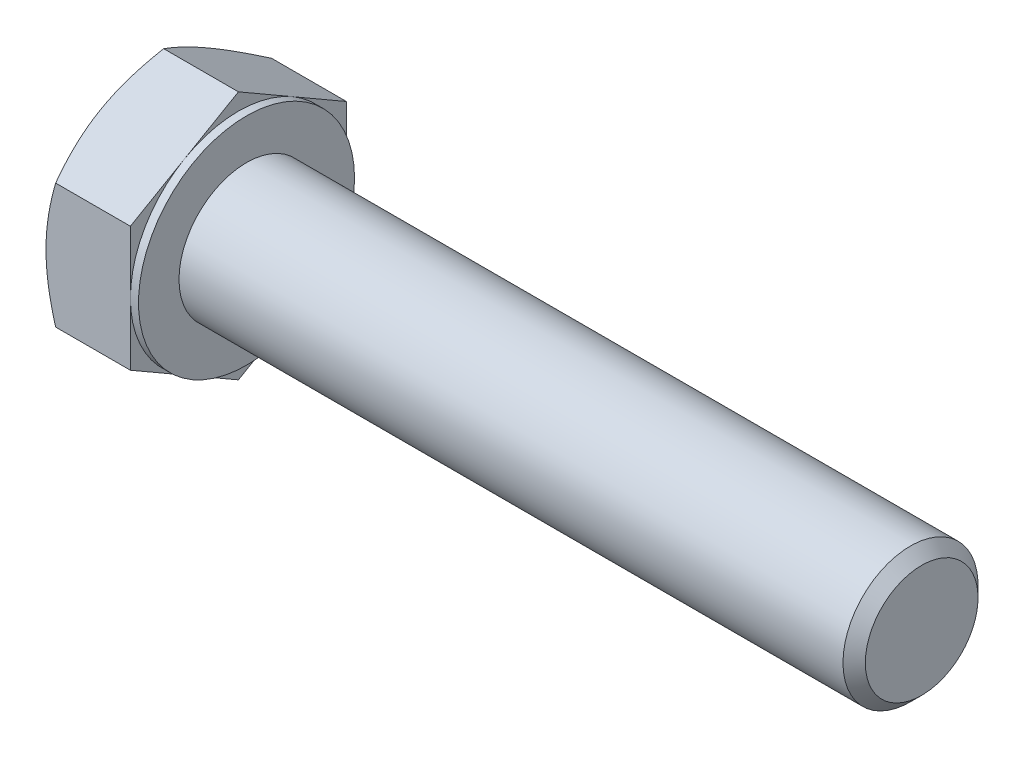
ISO-10303-21;
HEADER;
FILE_DESCRIPTION(('STEP AP214'),'2;1');
FILE_NAME('part.step','',(''),(''),'','','');
FILE_SCHEMA(('AUTOMOTIVE_DESIGN { 1 0 10303 214 1 1 1 1 }'));
ENDSEC;
DATA;
#1=APPLICATION_CONTEXT('core data for automotive mechanical design processes');
#2=APPLICATION_PROTOCOL_DEFINITION('international standard','automotive_design',2000,#1);
#3=PRODUCT_CONTEXT('',#1,'mechanical');
#4=PRODUCT('Part','Part','',(#3));
#5=PRODUCT_RELATED_PRODUCT_CATEGORY('part','',(#4));
#6=PRODUCT_DEFINITION_FORMATION('','',#4);
#7=PRODUCT_DEFINITION_CONTEXT('part definition',#1,'design');
#8=PRODUCT_DEFINITION('design','',#6,#7);
#9=PRODUCT_DEFINITION_SHAPE('','',#8);
#10=(LENGTH_UNIT() NAMED_UNIT(*) SI_UNIT(.MILLI.,.METRE.));
#11=(NAMED_UNIT(*) PLANE_ANGLE_UNIT() SI_UNIT($,.RADIAN.));
#12=(NAMED_UNIT(*) SI_UNIT($,.STERADIAN.) SOLID_ANGLE_UNIT());
#13=UNCERTAINTY_MEASURE_WITH_UNIT(LENGTH_MEASURE(1.E-05),#10,'distance_accuracy_value','');
#14=(GEOMETRIC_REPRESENTATION_CONTEXT(3) GLOBAL_UNCERTAINTY_ASSIGNED_CONTEXT((#13)) GLOBAL_UNIT_ASSIGNED_CONTEXT((#10,
#11,#12)) REPRESENTATION_CONTEXT('',''));
#15=CARTESIAN_POINT('',(0.,0.,0.));
#16=DIRECTION('',(0.,0.,1.));
#17=DIRECTION('',(1.,0.,0.));
#18=AXIS2_PLACEMENT_3D('',#15,#16,#17);
#19=CARTESIAN_POINT('',(6.85,9.23760430703402,0.));
#20=DIRECTION('',(1.,0.,0.));
#21=DIRECTION('',(0.,0.,-1.));
#22=AXIS2_PLACEMENT_3D('',#19,#20,#21);
#23=PLANE('',#22);
#24=CARTESIAN_POINT('',(6.85,0.,0.));
#25=DIRECTION('',(1.,0.,0.));
#26=DIRECTION('',(0.,0.,-1.));
#27=AXIS2_PLACEMENT_3D('',#24,#25,#26);
#28=CIRCLE('',#27,5.);
#29=CARTESIAN_POINT('',(6.85,0.,-5.));
#30=VERTEX_POINT('',#29);
#31=EDGE_CURVE('E273',#30,#30,#28,.F.);
#32=ORIENTED_EDGE('',*,*,#31,.T.);
#33=EDGE_LOOP('',(#32));
#34=FACE_BOUND('',#33,.T.);
#35=CARTESIAN_POINT('',(6.85,0.,0.));
#36=DIRECTION('',(1.,0.,0.));
#37=DIRECTION('',(0.,0.,-1.));
#38=AXIS2_PLACEMENT_3D('',#35,#36,#37);
#39=CIRCLE('',#38,8.);
#40=CARTESIAN_POINT('',(6.85,0.,-8.));
#41=VERTEX_POINT('',#40);
#42=EDGE_CURVE('E292',#41,#41,#39,.T.);
#43=ORIENTED_EDGE('',*,*,#42,.T.);
#44=EDGE_LOOP('',(#43));
#45=FACE_BOUND('',#44,.T.);
#46=ADVANCED_FACE('F35',(#34,#45),#23,.T.);
#47=CARTESIAN_POINT('',(0.,0.,0.));
#48=DIRECTION('',(-1.,0.,0.));
#49=DIRECTION('',(0.,0.,1.));
#50=AXIS2_PLACEMENT_3D('',#47,#48,#49);
#51=CYLINDRICAL_SURFACE('',#50,5.);
#52=ORIENTED_EDGE('',*,*,#31,.F.);
#53=EDGE_LOOP('',(#52));
#54=FACE_BOUND('',#53,.T.);
#55=CARTESIAN_POINT('',(56.022,0.,0.));
#56=DIRECTION('',(-1.,0.,0.));
#57=DIRECTION('',(0.,0.,1.));
#58=AXIS2_PLACEMENT_3D('',#55,#56,#57);
#59=CIRCLE('',#58,5.);
#60=CARTESIAN_POINT('',(56.022,0.,5.));
#61=VERTEX_POINT('',#60);
#62=EDGE_CURVE('E270',#61,#61,#59,.T.);
#63=ORIENTED_EDGE('',*,*,#62,.T.);
#64=EDGE_LOOP('',(#63));
#65=FACE_BOUND('',#64,.T.);
#66=ADVANCED_FACE('F244',(#54,#65),#51,.T.);
#67=CARTESIAN_POINT('',(56.85,0.,0.));
#68=DIRECTION('',(-1.,0.,0.));
#69=DIRECTION('',(0.,0.,1.));
#70=AXIS2_PLACEMENT_3D('',#67,#68,#69);
#71=CONICAL_SURFACE('',#70,4.172,0.785398163397444);
#72=ORIENTED_EDGE('',*,*,#62,.F.);
#73=EDGE_LOOP('',(#72));
#74=FACE_BOUND('',#73,.T.);
#75=CARTESIAN_POINT('',(56.85,0.,0.));
#76=DIRECTION('',(-1.,0.,0.));
#77=DIRECTION('',(0.,0.,1.));
#78=AXIS2_PLACEMENT_3D('',#75,#76,#77);
#79=CIRCLE('',#78,4.172);
#80=CARTESIAN_POINT('',(56.85,0.,4.172));
#81=VERTEX_POINT('',#80);
#82=EDGE_CURVE('E268',#81,#81,#79,.T.);
#83=ORIENTED_EDGE('',*,*,#82,.T.);
#84=EDGE_LOOP('',(#83));
#85=FACE_BOUND('',#84,.T.);
#86=ADVANCED_FACE('F249',(#74,#85),#71,.T.);
#87=CARTESIAN_POINT('',(56.85,0.,0.));
#88=DIRECTION('',(-1.,0.,0.));
#89=DIRECTION('',(0.,0.,1.));
#90=AXIS2_PLACEMENT_3D('',#87,#88,#89);
#91=PLANE('',#90);
#92=ORIENTED_EDGE('',*,*,#82,.F.);
#93=EDGE_LOOP('',(#92));
#94=FACE_BOUND('',#93,.T.);
#95=ADVANCED_FACE('F256',(#94),#91,.F.);
#96=CARTESIAN_POINT('',(6.25,8.,0.));
#97=DIRECTION('',(1.,0.,0.));
#98=DIRECTION('',(0.,0.,-1.));
#99=AXIS2_PLACEMENT_3D('',#96,#97,#98);
#100=PLANE('',#99);
#101=DIRECTION('',(0.,0.500000000000001,0.866025403784438));
#102=VECTOR('',#101,1.);
#103=CARTESIAN_POINT('',(6.25,4.618802153517,-8.));
#104=LINE('',#103,#102);
#105=CARTESIAN_POINT('',(6.25,4.618802153517,-8.));
#106=VERTEX_POINT('',#105);
#107=CARTESIAN_POINT('',(6.25,6.9282032302755,-4.00000000000001));
#108=VERTEX_POINT('',#107);
#109=EDGE_CURVE('E168',#106,#108,#104,.T.);
#110=ORIENTED_EDGE('',*,*,#109,.T.);
#111=CARTESIAN_POINT('',(6.25,0.,0.));
#112=DIRECTION('',(-1.,0.,0.));
#113=DIRECTION('',(0.,0.,1.));
#114=AXIS2_PLACEMENT_3D('',#111,#112,#113);
#115=CIRCLE('',#114,8.);
#116=CARTESIAN_POINT('',(6.25,0.,-8.));
#117=VERTEX_POINT('',#116);
#118=EDGE_CURVE('E51',#108,#117,#115,.T.);
#119=ORIENTED_EDGE('',*,*,#118,.T.);
#120=DIRECTION('',(0.,1.,0.));
#121=VECTOR('',#120,1.);
#122=CARTESIAN_POINT('',(6.25,4.618802153517,-8.));
#123=LINE('',#122,#121);
#124=EDGE_CURVE('E40',#117,#106,#123,.T.);
#125=ORIENTED_EDGE('',*,*,#124,.T.);
#126=EDGE_LOOP('',(#110,#119,#125));
#127=FACE_BOUND('',#126,.T.);
#128=ADVANCED_FACE('F259',(#127),#100,.T.);
#129=CARTESIAN_POINT('',(6.25,9.23760430703402,0.));
#130=VERTEX_POINT('',#129);
#131=EDGE_CURVE('E166',#108,#130,#104,.T.);
#132=ORIENTED_EDGE('',*,*,#131,.T.);
#133=DIRECTION('',(0.,-0.500000000000001,0.866025403784438));
#134=VECTOR('',#133,1.);
#135=CARTESIAN_POINT('',(6.25,9.23760430703402,0.));
#136=LINE('',#135,#134);
#137=CARTESIAN_POINT('',(6.25,6.9282032302755,4.00000000000001));
#138=VERTEX_POINT('',#137);
#139=EDGE_CURVE('E165',#130,#138,#136,.T.);
#140=ORIENTED_EDGE('',*,*,#139,.T.);
#141=EDGE_CURVE('E154',#138,#108,#115,.T.);
#142=ORIENTED_EDGE('',*,*,#141,.T.);
#143=EDGE_LOOP('',(#132,#140,#142));
#144=FACE_BOUND('',#143,.T.);
#145=ADVANCED_FACE('F264',(#144),#100,.T.);
#146=CARTESIAN_POINT('',(6.25,4.618802153517,8.));
#147=VERTEX_POINT('',#146);
#148=EDGE_CURVE('E133',#138,#147,#136,.T.);
#149=ORIENTED_EDGE('',*,*,#148,.T.);
#150=DIRECTION('',(0.,-1.,0.));
#151=VECTOR('',#150,1.);
#152=CARTESIAN_POINT('',(6.25,4.618802153517,8.));
#153=LINE('',#152,#151);
#154=CARTESIAN_POINT('',(6.25,0.,8.));
#155=VERTEX_POINT('',#154);
#156=EDGE_CURVE('E127',#147,#155,#153,.T.);
#157=ORIENTED_EDGE('',*,*,#156,.T.);
#158=EDGE_CURVE('E131',#155,#138,#115,.T.);
#159=ORIENTED_EDGE('',*,*,#158,.T.);
#160=EDGE_LOOP('',(#149,#157,#159));
#161=FACE_BOUND('',#160,.T.);
#162=ADVANCED_FACE('F129',(#161),#100,.T.);
#163=CARTESIAN_POINT('',(6.25,-4.61880215351699,8.));
#164=VERTEX_POINT('',#163);
#165=EDGE_CURVE('E137',#155,#164,#153,.T.);
#166=ORIENTED_EDGE('',*,*,#165,.T.);
#167=DIRECTION('',(0.,-0.500000000000002,-0.866025403784437));
#168=VECTOR('',#167,1.);
#169=CARTESIAN_POINT('',(6.25,-9.23760430703402,0.));
#170=LINE('',#169,#168);
#171=CARTESIAN_POINT('',(6.25,-6.9282032302755,4.00000000000002));
#172=VERTEX_POINT('',#171);
#173=EDGE_CURVE('E144',#164,#172,#170,.T.);
#174=ORIENTED_EDGE('',*,*,#173,.T.);
#175=EDGE_CURVE('E141',#172,#155,#115,.T.);
#176=ORIENTED_EDGE('',*,*,#175,.T.);
#177=EDGE_LOOP('',(#166,#174,#176));
#178=FACE_BOUND('',#177,.T.);
#179=ADVANCED_FACE('F142',(#178),#100,.T.);
#180=CARTESIAN_POINT('',(6.25,-9.23760430703402,0.));
#181=VERTEX_POINT('',#180);
#182=EDGE_CURVE('E160',#172,#181,#170,.T.);
#183=ORIENTED_EDGE('',*,*,#182,.T.);
#184=DIRECTION('',(0.,0.5,-0.866025403784439));
#185=VECTOR('',#184,1.);
#186=CARTESIAN_POINT('',(6.25,-4.61880215351701,-8.));
#187=LINE('',#186,#185);
#188=CARTESIAN_POINT('',(6.25,-6.92820323027551,-4.));
#189=VERTEX_POINT('',#188);
#190=EDGE_CURVE('E328',#181,#189,#187,.T.);
#191=ORIENTED_EDGE('',*,*,#190,.T.);
#192=EDGE_CURVE('E148',#189,#172,#115,.T.);
#193=ORIENTED_EDGE('',*,*,#192,.T.);
#194=EDGE_LOOP('',(#183,#191,#193));
#195=FACE_BOUND('',#194,.T.);
#196=ADVANCED_FACE('F333',(#195),#100,.T.);
#197=CARTESIAN_POINT('',(6.25,-4.61880215351701,-8.));
#198=VERTEX_POINT('',#197);
#199=EDGE_CURVE('E155',#189,#198,#187,.T.);
#200=ORIENTED_EDGE('',*,*,#199,.T.);
#201=EDGE_CURVE('E11',#198,#117,#123,.T.);
#202=ORIENTED_EDGE('',*,*,#201,.T.);
#203=EDGE_CURVE('E346',#117,#189,#115,.T.);
#204=ORIENTED_EDGE('',*,*,#203,.T.);
#205=EDGE_LOOP('',(#200,#202,#204));
#206=FACE_BOUND('',#205,.T.);
#207=ADVANCED_FACE('F265',(#206),#100,.T.);
#208=CARTESIAN_POINT('',(0.,0.,0.));
#209=DIRECTION('',(-1.,0.,0.));
#210=DIRECTION('',(0.,0.,1.));
#211=AXIS2_PLACEMENT_3D('',#208,#209,#210);
#212=CYLINDRICAL_SURFACE('',#211,8.);
#213=ORIENTED_EDGE('',*,*,#118,.F.);
#214=ORIENTED_EDGE('',*,*,#141,.F.);
#215=ORIENTED_EDGE('',*,*,#158,.F.);
#216=ORIENTED_EDGE('',*,*,#175,.F.);
#217=ORIENTED_EDGE('',*,*,#192,.F.);
#218=ORIENTED_EDGE('',*,*,#203,.F.);
#219=EDGE_LOOP('',(#213,#214,#215,#216,#217,#218));
#220=FACE_BOUND('',#219,.T.);
#221=ORIENTED_EDGE('',*,*,#42,.F.);
#222=EDGE_LOOP('',(#221));
#223=FACE_BOUND('',#222,.T.);
#224=ADVANCED_FACE('F151',(#220,#223),#212,.T.);
#225=CARTESIAN_POINT('',(0.,9.23760430703402,0.));
#226=DIRECTION('',(1.,0.,0.));
#227=DIRECTION('',(0.,0.,-1.));
#228=AXIS2_PLACEMENT_3D('',#225,#226,#227);
#229=PLANE('',#228);
#230=CARTESIAN_POINT('',(0.,0.,0.));
#231=DIRECTION('',(1.,0.,0.));
#232=DIRECTION('',(0.,0.,-1.));
#233=AXIS2_PLACEMENT_3D('',#230,#231,#232);
#234=CIRCLE('',#233,8.);
#235=CARTESIAN_POINT('',(0.,0.,-8.));
#236=VERTEX_POINT('',#235);
#237=CARTESIAN_POINT('',(0.,6.9282032302755,-4.00000000000001));
#238=VERTEX_POINT('',#237);
#239=EDGE_CURVE('E291',#236,#238,#234,.T.);
#240=ORIENTED_EDGE('',*,*,#239,.F.);
#241=CARTESIAN_POINT('',(0.,-6.92820323027551,-4.));
#242=VERTEX_POINT('',#241);
#243=EDGE_CURVE('E288',#242,#236,#234,.T.);
#244=ORIENTED_EDGE('',*,*,#243,.F.);
#245=CARTESIAN_POINT('',(0.,-6.9282032302755,4.00000000000002));
#246=VERTEX_POINT('',#245);
#247=EDGE_CURVE('E290',#246,#242,#234,.T.);
#248=ORIENTED_EDGE('',*,*,#247,.F.);
#249=CARTESIAN_POINT('',(0.,0.,8.));
#250=VERTEX_POINT('',#249);
#251=EDGE_CURVE('E300',#250,#246,#234,.T.);
#252=ORIENTED_EDGE('',*,*,#251,.F.);
#253=CARTESIAN_POINT('',(0.,0.,0.));
#254=DIRECTION('',(-1.,0.,0.));
#255=DIRECTION('',(0.,0.,1.));
#256=AXIS2_PLACEMENT_3D('',#253,#254,#255);
#257=CIRCLE('',#256,8.);
#258=CARTESIAN_POINT('',(0.,6.92820323027551,4.00000000000001));
#259=VERTEX_POINT('',#258);
#260=EDGE_CURVE('E169',#250,#259,#257,.T.);
#261=ORIENTED_EDGE('',*,*,#260,.T.);
#262=EDGE_CURVE('E295',#238,#259,#234,.T.);
#263=ORIENTED_EDGE('',*,*,#262,.F.);
#264=EDGE_LOOP('',(#240,#244,#248,#252,#261,#263));
#265=FACE_BOUND('',#264,.T.);
#266=ADVANCED_FACE('F198',(#265),#229,.F.);
#267=CARTESIAN_POINT('',(0.,0.,0.));
#268=DIRECTION('',(1.,0.,0.));
#269=DIRECTION('',(0.,0.,-1.));
#270=AXIS2_PLACEMENT_3D('',#267,#268,#269);
#271=CONICAL_SURFACE('',#270,8.,1.0471975511966);
#272=CARTESIAN_POINT('',(0.714597847732973,4.61868668346316,8.0002));
#273=CARTESIAN_POINT('',(0.655990714047298,4.72021302617289,7.8243512161201));
#274=CARTESIAN_POINT('',(0.60004340104729,4.82211789504563,7.64784680569387));
#275=CARTESIAN_POINT('',(0.494201005024666,5.02675523421805,7.29340453712154));
#276=CARTESIAN_POINT('',(0.444308534431066,5.12948804149869,7.11546609530729));
#277=CARTESIAN_POINT('',(0.304692797206865,5.43933133858026,6.57880176237736));
#278=CARTESIAN_POINT('',(0.225281170978367,5.64766491807817,6.21795741776428));
#279=CARTESIAN_POINT('',(0.132161646294488,5.95943209350316,5.67796082979595));
#280=CARTESIAN_POINT('',(0.105634581029124,6.06193429416807,5.50042181035672));
#281=CARTESIAN_POINT('',(0.0611531748588749,6.26740224104454,5.1445408870398));
#282=CARTESIAN_POINT('',(0.0431980765145786,6.37036794548791,4.96619905550676));
#283=CARTESIAN_POINT('',(0.0163156484918637,6.57647664551585,4.60920831517641));
#284=CARTESIAN_POINT('',(0.00737807354623249,6.67961930623067,4.4305599863905));
#285=CARTESIAN_POINT('',(-0.00127769603487075,6.88599991003618,4.07309829490262));
#286=CARTESIAN_POINT('',(-0.000996175497151423,6.98923785008464,3.89428493746994));
#287=CARTESIAN_POINT('',(0.00814502526877439,7.18224506616975,3.5599866329831));
#288=CARTESIAN_POINT('',(0.015889604367369,7.27202796205376,3.40447809566133));
#289=CARTESIAN_POINT('',(0.0382011348534278,7.45138347289924,3.09382523825949));
#290=CARTESIAN_POINT('',(0.0527685461381466,7.5409560732765,2.93868094344));
#291=CARTESIAN_POINT('',(0.106360690527535,7.80932710333148,2.47384868410519));
#292=CARTESIAN_POINT('',(0.155268641669143,7.98765049311728,2.16498351281828));
#293=CARTESIAN_POINT('',(0.277539403234313,8.34618890253624,1.5439767712397));
#294=CARTESIAN_POINT('',(0.351420520375999,8.52635816315522,1.23191445788553));
#295=CARTESIAN_POINT('',(0.519100141254972,8.88400987687704,0.612443518305243));
#296=CARTESIAN_POINT('',(0.612859260854456,9.06149691008278,0.30502695910825));
#297=CARTESIAN_POINT('',(0.714597847732976,9.23771977708786,-0.000199999999999687));
#298=B_SPLINE_CURVE_WITH_KNOTS('',3,(#272,#273,#274,#275,#276,#277,#278,#279,#280,#281,#282,
#283,#284,#285,#286,#287,#288,#289,#290,#291,#292,#293,#294,#295,#296,#297),.UNSPECIFIED.,.F.,
.F.,(4,2,2,2,2,2,2,2,2,2,2,2,4),(0.,0.63397354372135,1.26821965714356,2.53934712434766,
3.15934343977049,3.77928496069784,4.39852133866766,5.01773858515595,5.55680239410249,
6.09590254421148,7.17487077411835,8.27776850154293,9.37850115249055),.UNSPECIFIED.);
#299=CARTESIAN_POINT('',(0.714531179816326,9.23760430703402,0.));
#300=VERTEX_POINT('',#299);
#301=EDGE_CURVE('E216',#259,#300,#298,.T.);
#302=ORIENTED_EDGE('',*,*,#301,.T.);
#303=CARTESIAN_POINT('',(0.714597847732978,9.23771977708786,0.0002));
#304=CARTESIAN_POINT('',(0.655990714047302,9.13619343437813,-0.175648783879896));
#305=CARTESIAN_POINT('',(0.600043401047294,9.03428856550538,-0.352153194306134));
#306=CARTESIAN_POINT('',(0.49420100502467,8.82965122633297,-0.706595462878459));
#307=CARTESIAN_POINT('',(0.44430853443107,8.72691841905233,-0.884533904692712));
#308=CARTESIAN_POINT('',(0.304692797206869,8.41707512197076,-1.42119823762264));
#309=CARTESIAN_POINT('',(0.225281170978369,8.20874154247284,-1.78204258223572));
#310=CARTESIAN_POINT('',(0.132161646294489,7.89697436704785,-2.32203917020405));
#311=CARTESIAN_POINT('',(0.105634581029124,7.79447216638295,-2.49957818964329));
#312=CARTESIAN_POINT('',(0.0611531748588754,7.58900421950647,-2.8554591129602));
#313=CARTESIAN_POINT('',(0.0431980765145794,7.4860385150631,-3.03380094449324));
#314=CARTESIAN_POINT('',(0.016315648491864,7.27992981503516,-3.39079168482359));
#315=CARTESIAN_POINT('',(0.007378073546232,7.17678715432034,-3.5694400136095));
#316=CARTESIAN_POINT('',(-0.00127769603487176,6.97040655051484,-3.92690170509738));
#317=CARTESIAN_POINT('',(-0.000996175497152152,6.86716861046638,-4.10571506253007));
#318=CARTESIAN_POINT('',(0.00814502526877338,6.67416139438126,-4.44001336701691));
#319=CARTESIAN_POINT('',(0.0158896043673675,6.58437849849726,-4.59552190433867));
#320=CARTESIAN_POINT('',(0.038201134853426,6.40502298765178,-4.90617476174051));
#321=CARTESIAN_POINT('',(0.052768546138145,6.31545038727451,-5.06131905656));
#322=CARTESIAN_POINT('',(0.106360690527533,6.04707935721953,-5.52615131589482));
#323=CARTESIAN_POINT('',(0.155268641669141,5.86875596743374,-5.83501648718172));
#324=CARTESIAN_POINT('',(0.27753940323431,5.51021755801477,-6.4560232287603));
#325=CARTESIAN_POINT('',(0.351420520375995,5.3300482973958,-6.76808554211448));
#326=CARTESIAN_POINT('',(0.519100141254967,4.97239658367397,-7.38755648169476));
#327=CARTESIAN_POINT('',(0.612859260854451,4.79490955046824,-7.69497304089175));
#328=CARTESIAN_POINT('',(0.714597847732973,4.61868668346316,-8.0002));
#329=B_SPLINE_CURVE_WITH_KNOTS('',3,(#303,#304,#305,#306,#307,#308,#309,#310,#311,#312,#313,
#314,#315,#316,#317,#318,#319,#320,#321,#322,#323,#324,#325,#326,#327,#328),.UNSPECIFIED.,.F.,
.F.,(4,2,2,2,2,2,2,2,2,2,2,2,4),(0.,0.63397354372135,1.26821965714356,2.53934712434766,
3.15934343977049,3.77928496069784,4.39852133866766,5.01773858515596,5.55680239410249,
6.09590254421148,7.17487077411836,8.27776850154294,9.37850115249056),.UNSPECIFIED.);
#330=EDGE_CURVE('E59',#300,#238,#329,.T.);
#331=ORIENTED_EDGE('',*,*,#330,.T.);
#332=ORIENTED_EDGE('',*,*,#262,.T.);
#333=EDGE_LOOP('',(#302,#331,#332));
#334=FACE_BOUND('',#333,.T.);
#335=ADVANCED_FACE('F342',(#334),#271,.T.);
#336=CARTESIAN_POINT('',(4.0249059095589,-12.6546855843617,8.));
#337=CARTESIAN_POINT('',(3.85338487375992,-12.3031246800229,8.));
#338=CARTESIAN_POINT('',(3.68343819387202,-11.9507829192251,8.));
#339=CARTESIAN_POINT('',(3.34757427772116,-11.2441233293434,8.));
#340=CARTESIAN_POINT('',(3.18165763115451,-10.8898052202859,8.));
#341=CARTESIAN_POINT('',(2.85395194343768,-10.1770689379398,8.));
#342=CARTESIAN_POINT('',(2.69218824963992,-9.81863907172209,8.));
#343=CARTESIAN_POINT('',(2.3749572674034,-9.09901412811098,8.));
#344=CARTESIAN_POINT('',(2.21948969724235,-8.73781917530421,8.));
#345=CARTESIAN_POINT('',(1.91124909611307,-7.99950051377994,8.));
#346=CARTESIAN_POINT('',(1.75875676572667,-7.6222589905811,8.));
#347=CARTESIAN_POINT('',(1.4647241129891,-6.86345576673941,8.));
#348=CARTESIAN_POINT('',(1.32318498461757,-6.48189360029687,8.));
#349=CARTESIAN_POINT('',(1.05459432501408,-5.71447512364443,8.));
#350=CARTESIAN_POINT('',(0.927515476081564,-5.32862847439954,8.));
#351=CARTESIAN_POINT('',(0.691757211097745,-4.55141880373957,8.));
#352=CARTESIAN_POINT('',(0.583072254842117,-4.16005748194272,8.));
#353=CARTESIAN_POINT('',(0.389750376844221,-3.37376378274519,8.));
#354=CARTESIAN_POINT('',(0.304973724086276,-2.97886668674348,8.));
#355=CARTESIAN_POINT('',(0.199275200237229,-2.38273452840881,8.));
#356=CARTESIAN_POINT('',(0.167618755709461,-2.18337977711938,8.));
#357=CARTESIAN_POINT('',(0.112075358694774,-1.78359737601684,8.));
#358=CARTESIAN_POINT('',(0.0881876500546178,-1.58316983255304,8.));
#359=CARTESIAN_POINT('',(0.0489706977401169,-1.18423542027824,8.));
#360=CARTESIAN_POINT('',(0.0335291730980844,-0.985739637458754,8.));
#361=CARTESIAN_POINT('',(0.011062971648863,-0.588272086946668,8.));
#362=CARTESIAN_POINT('',(0.00403814825767037,-0.38930032760408,8.));
#363=CARTESIAN_POINT('',(-0.00142584062082103,0.00876221081484965,8.));
#364=CARTESIAN_POINT('',(0.000134957676474712,0.207852989385609,8.));
#365=CARTESIAN_POINT('',(0.0118014217876188,0.605786203078691,8.));
#366=CARTESIAN_POINT('',(0.0219074673810709,0.804628626769926,8.));
#367=CARTESIAN_POINT('',(0.0557165373437159,1.27520491378394,8.));
#368=CARTESIAN_POINT('',(0.083067269524208,1.54668291471765,8.));
#369=CARTESIAN_POINT('',(0.152259238389071,2.08777092307493,8.));
#370=CARTESIAN_POINT('',(0.194102243863656,2.35738069838157,8.));
#371=CARTESIAN_POINT('',(0.339163188799743,3.16301774665639,8.));
#372=CARTESIAN_POINT('',(0.461891294668976,3.69558688173418,8.));
#373=CARTESIAN_POINT('',(0.67658659521306,4.49226053267631,8.));
#374=CARTESIAN_POINT('',(0.754301850106129,4.76044512009594,8.));
#375=CARTESIAN_POINT('',(0.918275616254535,5.29421544036087,8.));
#376=CARTESIAN_POINT('',(1.00453419017724,5.55980115412707,8.));
#377=CARTESIAN_POINT('',(1.18417203245489,6.0884483689393,8.));
#378=CARTESIAN_POINT('',(1.27754931556251,6.35151055086865,8.));
#379=CARTESIAN_POINT('',(1.47027924561322,6.87542420819581,8.));
#380=CARTESIAN_POINT('',(1.56963178297476,7.13627572403549,8.));
#381=CARTESIAN_POINT('',(1.83061788216801,7.80218874880574,8.));
#382=CARTESIAN_POINT('',(1.99585030591403,8.20583800152901,8.));
#383=CARTESIAN_POINT('',(2.33560643435574,9.00922090340245,8.));
#384=CARTESIAN_POINT('',(2.5101309931742,9.40895418858891,8.));
#385=CARTESIAN_POINT('',(2.86641484762338,10.2053302393418,8.));
#386=CARTESIAN_POINT('',(3.04817649203489,10.6019719507727,8.));
#387=CARTESIAN_POINT('',(3.41731474780413,11.3926098653434,8.));
#388=CARTESIAN_POINT('',(3.60469117417197,11.7866061551194,8.));
#389=CARTESIAN_POINT('',(3.98417976786821,12.5730081264133,8.));
#390=CARTESIAN_POINT('',(4.17629837893025,12.9654106921397,8.));
#391=CARTESIAN_POINT('',(4.56413460673707,13.7484335593548,8.));
#392=CARTESIAN_POINT('',(4.75985224746019,14.1390538489476,8.));
#393=CARTESIAN_POINT('',(5.15417790496087,14.9187386930099,8.));
#394=CARTESIAN_POINT('',(5.3527853705295,15.3078035265797,8.));
#395=CARTESIAN_POINT('',(5.75241277357116,16.0846929446672,8.));
#396=CARTESIAN_POINT('',(5.95343272118932,16.4725175239607,8.));
#397=CARTESIAN_POINT('',(6.52023157707933,17.5591699504467,8.));
#398=CARTESIAN_POINT('',(6.8882666916266,18.2568207923884,8.));
#399=CARTESIAN_POINT('',(7.62911645716787,19.6496204420456,8.));
#400=CARTESIAN_POINT('',(8.00193135552977,20.3447691178627,8.));
#401=CARTESIAN_POINT('',(8.74998840178782,21.7309493426279,8.));
#402=CARTESIAN_POINT('',(9.12521929790289,22.4219869677796,8.));
#403=CARTESIAN_POINT('',(9.69012625678305,23.4573861735835,8.));
#404=CARTESIAN_POINT('',(9.87876537279047,23.8023143161837,8.));
#405=CARTESIAN_POINT('',(10.2566598278908,24.4918321964471,8.));
#406=CARTESIAN_POINT('',(10.4459151660088,24.8364219346447,8.));
#407=CARTESIAN_POINT('',(10.635441440782,25.1808626322182,8.));
#408=B_SPLINE_CURVE_WITH_KNOTS('',3,(#336,#337,#338,#339,#340,#341,#342,#343,#344,#345,#346,
#347,#348,#349,#350,#351,#352,#353,#354,#355,#356,#357,#358,#359,#360,#361,#362,#363,#364,#365,
#366,#367,#368,#369,#370,#371,#372,#373,#374,#375,#376,#377,#378,#379,#380,#381,#382,#383,#384,
#385,#386,#387,#388,#389,#390,#391,#392,#393,#394,#395,#396,#397,#398,#399,#400,#401,#402,#403,
#404,#405,#406,#407),.UNSPECIFIED.,.F.,.F.,(4,2,2,2,2,2,2,2,2,2,2,2,2,2,2,2,2,2,2,2,2,2,2,2,2,2,
2,2,2,2,2,2,2,2,2,4),(0.,1.17352534285519,2.34722138025917,3.52689945010166,4.70652467637677,
5.92708317141315,7.14777452944079,8.36612012171133,9.58409809506409,10.7948027119676,
11.4002329189197,12.0056041799731,12.6027191107726,13.199823642157,13.7969256548693,
14.3940542062034,15.2121538291978,16.0303533369241,17.6675489652002,18.5051258655031,
19.3427089100958,20.1800592201862,21.0173941785985,22.3257038346385,23.6341339573728,
24.9429922461244,26.2518074593073,27.5625113626671,28.8732240016859,30.1836898283921,
31.4941611678941,33.8604585893124,36.2268789719357,38.5858914350282,39.7653150976312,
40.9447368953005),.UNSPECIFIED.);
#409=CARTESIAN_POINT('',(0.714531179816321,4.618802153517,8.));
#410=VERTEX_POINT('',#409);
#411=EDGE_CURVE('E228',#250,#410,#408,.T.);
#412=ORIENTED_EDGE('',*,*,#411,.T.);
#413=EDGE_CURVE('E227',#410,#259,#298,.T.);
#414=ORIENTED_EDGE('',*,*,#413,.T.);
#415=ORIENTED_EDGE('',*,*,#260,.F.);
#416=EDGE_LOOP('',(#412,#414,#415));
#417=FACE_BOUND('',#416,.T.);
#418=ADVANCED_FACE('F338',(#417),#271,.T.);
#419=CARTESIAN_POINT('',(0.714531179816317,-4.61880215351699,8.));
#420=VERTEX_POINT('',#419);
#421=EDGE_CURVE('E271',#420,#250,#408,.T.);
#422=ORIENTED_EDGE('',*,*,#421,.T.);
#423=ORIENTED_EDGE('',*,*,#251,.T.);
#424=CARTESIAN_POINT('',(0.714597847732978,-9.23771977708786,-0.000200000000000067));
#425=CARTESIAN_POINT('',(0.655990714047302,-9.13619343437813,0.175648783879896));
#426=CARTESIAN_POINT('',(0.600043401047294,-9.03428856550538,0.352153194306134));
#427=CARTESIAN_POINT('',(0.49420100502467,-8.82965122633297,0.706595462878458));
#428=CARTESIAN_POINT('',(0.44430853443107,-8.72691841905233,0.88453390469271));
#429=CARTESIAN_POINT('',(0.304692797206868,-8.41707512197076,1.42119823762264));
#430=CARTESIAN_POINT('',(0.225281170978369,-8.20874154247285,1.78204258223572));
#431=CARTESIAN_POINT('',(0.132161646294488,-7.89697436704785,2.32203917020405));
#432=CARTESIAN_POINT('',(0.105634581029123,-7.79447216638294,2.49957818964328));
#433=CARTESIAN_POINT('',(0.0611531748588742,-7.58900421950647,2.8554591129602));
#434=CARTESIAN_POINT('',(0.0431980765145779,-7.4860385150631,3.03380094449324));
#435=CARTESIAN_POINT('',(0.0163156484918621,-7.27992981503516,3.39079168482359));
#436=CARTESIAN_POINT('',(0.00737807354622992,-7.17678715432034,3.5694400136095));
#437=CARTESIAN_POINT('',(-0.00127769603487395,-6.97040655051483,3.92690170509738));
#438=CARTESIAN_POINT('',(-0.00099617549715423,-6.86716861046637,4.10571506253006));
#439=CARTESIAN_POINT('',(0.00814502526877121,-6.67416139438126,4.4400133670169));
#440=CARTESIAN_POINT('',(0.0158896043673652,-6.58437849849725,4.59552190433867));
#441=CARTESIAN_POINT('',(0.0382011348534231,-6.40502298765177,4.90617476174051));
#442=CARTESIAN_POINT('',(0.0527685461381418,-6.31545038727451,5.06131905656));
#443=CARTESIAN_POINT('',(0.106360690527529,-6.04707935721953,5.52615131589482));
#444=CARTESIAN_POINT('',(0.155268641669137,-5.86875596743373,5.83501648718172));
#445=CARTESIAN_POINT('',(0.277539403234306,-5.51021755801476,6.4560232287603));
#446=CARTESIAN_POINT('',(0.351420520375992,-5.33004829739579,6.76808554211448));
#447=CARTESIAN_POINT('',(0.519100141254964,-4.97239658367396,7.38755648169476));
#448=CARTESIAN_POINT('',(0.612859260854447,-4.79490955046823,7.69497304089175));
#449=CARTESIAN_POINT('',(0.714597847732968,-4.61868668346315,8.0002));
#450=B_SPLINE_CURVE_WITH_KNOTS('',3,(#424,#425,#426,#427,#428,#429,#430,#431,#432,#433,#434,
#435,#436,#437,#438,#439,#440,#441,#442,#443,#444,#445,#446,#447,#448,#449),.UNSPECIFIED.,.F.,
.F.,(4,2,2,2,2,2,2,2,2,2,2,2,4),(0.,0.63397354372135,1.26821965714356,2.53934712434766,
3.15934343977049,3.77928496069784,4.39852133866766,5.01773858515596,5.55680239410249,
6.09590254421148,7.17487077411836,8.27776850154294,9.37850115249056),.UNSPECIFIED.);
#451=EDGE_CURVE('E218',#246,#420,#450,.T.);
#452=ORIENTED_EDGE('',*,*,#451,.T.);
#453=EDGE_LOOP('',(#422,#423,#452));
#454=FACE_BOUND('',#453,.T.);
#455=ADVANCED_FACE('F187',(#454),#271,.T.);
#456=CARTESIAN_POINT('',(0.714531179816326,-9.23760430703402,0.));
#457=VERTEX_POINT('',#456);
#458=EDGE_CURVE('E211',#457,#246,#450,.T.);
#459=ORIENTED_EDGE('',*,*,#458,.T.);
#460=ORIENTED_EDGE('',*,*,#247,.T.);
#461=CARTESIAN_POINT('',(0.714597847732977,-4.61868668346318,-8.0002));
#462=CARTESIAN_POINT('',(0.655990714047302,-4.7202130261729,-7.8243512161201));
#463=CARTESIAN_POINT('',(0.600043401047294,-4.82211789504565,-7.64784680569386));
#464=CARTESIAN_POINT('',(0.49420100502467,-5.02675523421806,-7.29340453712154));
#465=CARTESIAN_POINT('',(0.44430853443107,-5.1294880414987,-7.11546609530729));
#466=CARTESIAN_POINT('',(0.304692797206869,-5.43933133858027,-6.57880176237736));
#467=CARTESIAN_POINT('',(0.225281170978371,-5.64766491807818,-6.21795741776427));
#468=CARTESIAN_POINT('',(0.132161646294491,-5.95943209350318,-5.67796082979595));
#469=CARTESIAN_POINT('',(0.105634581029127,-6.06193429416808,-5.50042181035671));
#470=CARTESIAN_POINT('',(0.0611531748588782,-6.26740224104456,-5.1445408870398));
#471=CARTESIAN_POINT('',(0.0431980765145826,-6.37036794548793,-4.96619905550676));
#472=CARTESIAN_POINT('',(0.0163156484918675,-6.57647664551586,-4.6092083151764));
#473=CARTESIAN_POINT('',(0.00737807354623543,-6.67961930623068,-4.4305599863905));
#474=CARTESIAN_POINT('',(-0.00127769603486793,-6.88599991003619,-4.07309829490261));
#475=CARTESIAN_POINT('',(-0.000996175497147871,-6.98923785008465,-3.89428493746993));
#476=CARTESIAN_POINT('',(0.00814502526877877,-7.18224506616976,-3.55998663298309));
#477=CARTESIAN_POINT('',(0.0158896043673735,-7.27202796205377,-3.40447809566133));
#478=CARTESIAN_POINT('',(0.0382011348534319,-7.45138347289925,-3.09382523825949));
#479=CARTESIAN_POINT('',(0.0527685461381502,-7.54095607327651,-2.93868094344));
#480=CARTESIAN_POINT('',(0.106360690527537,-7.80932710333149,-2.47384868410518));
#481=CARTESIAN_POINT('',(0.155268641669146,-7.98765049311728,-2.16498351281828));
#482=CARTESIAN_POINT('',(0.277539403234316,-8.34618890253625,-1.5439767712397));
#483=CARTESIAN_POINT('',(0.351420520376001,-8.52635816315522,-1.23191445788552));
#484=CARTESIAN_POINT('',(0.519100141254973,-8.88400987687704,-0.61244351830524));
#485=CARTESIAN_POINT('',(0.612859260854456,-9.06149691008278,-0.305026959108248));
#486=CARTESIAN_POINT('',(0.714597847732977,-9.23771977708786,0.000200000000000315));
#487=B_SPLINE_CURVE_WITH_KNOTS('',3,(#461,#462,#463,#464,#465,#466,#467,#468,#469,#470,#471,
#472,#473,#474,#475,#476,#477,#478,#479,#480,#481,#482,#483,#484,#485,#486),.UNSPECIFIED.,.F.,
.F.,(4,2,2,2,2,2,2,2,2,2,2,2,4),(0.,0.633973543721352,1.26821965714356,2.53934712434766,
3.15934343977049,3.77928496069784,4.39852133866766,5.01773858515595,5.55680239410249,
6.09590254421148,7.17487077411835,8.27776850154292,9.37850115249054),.UNSPECIFIED.);
#488=EDGE_CURVE('E217',#242,#457,#487,.T.);
#489=ORIENTED_EDGE('',*,*,#488,.T.);
#490=EDGE_LOOP('',(#459,#460,#489));
#491=FACE_BOUND('',#490,.T.);
#492=ADVANCED_FACE('F309',(#491),#271,.T.);
#493=CARTESIAN_POINT('',(0.71453117981632,4.618802153517,-8.));
#494=VERTEX_POINT('',#493);
#495=EDGE_CURVE('E219',#238,#494,#329,.T.);
#496=ORIENTED_EDGE('',*,*,#495,.T.);
#497=CARTESIAN_POINT('',(4.02490590955892,-12.6546855843617,-8.));
#498=CARTESIAN_POINT('',(3.85338487375994,-12.3031246800229,-8.));
#499=CARTESIAN_POINT('',(3.68343819387203,-11.9507829192251,-8.));
#500=CARTESIAN_POINT('',(3.34757427772118,-11.2441233293434,-8.));
#501=CARTESIAN_POINT('',(3.18165763115452,-10.889805220286,-8.));
#502=CARTESIAN_POINT('',(2.85395194343769,-10.1770689379399,-8.));
#503=CARTESIAN_POINT('',(2.69218824963993,-9.81863907172212,-8.));
#504=CARTESIAN_POINT('',(2.37495726740341,-9.09901412811101,-8.));
#505=CARTESIAN_POINT('',(2.21948969724236,-8.73781917530424,-8.));
#506=CARTESIAN_POINT('',(1.91124909611308,-7.99950051377997,-8.));
#507=CARTESIAN_POINT('',(1.75875676572668,-7.62225899058113,-8.));
#508=CARTESIAN_POINT('',(1.46472411298911,-6.86345576673944,-8.));
#509=CARTESIAN_POINT('',(1.32318498461758,-6.4818936002969,-8.));
#510=CARTESIAN_POINT('',(1.05459432501409,-5.71447512364446,-8.));
#511=CARTESIAN_POINT('',(0.927515476081571,-5.32862847439956,-8.));
#512=CARTESIAN_POINT('',(0.691757211097752,-4.55141880373959,-8.));
#513=CARTESIAN_POINT('',(0.583072254842124,-4.16005748194275,-8.));
#514=CARTESIAN_POINT('',(0.389750376844227,-3.37376378274521,-8.));
#515=CARTESIAN_POINT('',(0.304973724086282,-2.9788666867435,-8.));
#516=CARTESIAN_POINT('',(0.199275200237234,-2.38273452840883,-8.));
#517=CARTESIAN_POINT('',(0.167618755709465,-2.18337977711941,-8.));
#518=CARTESIAN_POINT('',(0.112075358694778,-1.78359737601687,-8.));
#519=CARTESIAN_POINT('',(0.0881876500546208,-1.58316983255306,-8.));
#520=CARTESIAN_POINT('',(0.0489706977401194,-1.18423542027826,-8.));
#521=CARTESIAN_POINT('',(0.0335291730980864,-0.985739637458776,-8.));
#522=CARTESIAN_POINT('',(0.0110629716488641,-0.58827208694669,-8.));
#523=CARTESIAN_POINT('',(0.00403814825767106,-0.389300327604101,-8.));
#524=CARTESIAN_POINT('',(-0.00142584062082067,0.00876221081482956,-8.));
#525=CARTESIAN_POINT('',(0.000134957676475133,0.207852989385588,-8.));
#526=CARTESIAN_POINT('',(0.0118014217876193,0.605786203078672,-8.));
#527=CARTESIAN_POINT('',(0.0219074673810715,0.804628626769908,-8.));
#528=CARTESIAN_POINT('',(0.0557165373437159,1.27520491378392,-8.));
#529=CARTESIAN_POINT('',(0.0830672695242071,1.54668291471763,-8.));
#530=CARTESIAN_POINT('',(0.152259238389069,2.08777092307492,-8.));
#531=CARTESIAN_POINT('',(0.194102243863653,2.35738069838155,-8.));
#532=CARTESIAN_POINT('',(0.339163188799738,3.16301774665637,-8.));
#533=CARTESIAN_POINT('',(0.461891294668971,3.69558688173416,-8.));
#534=CARTESIAN_POINT('',(0.676586595213053,4.49226053267629,-8.));
#535=CARTESIAN_POINT('',(0.754301850106121,4.76044512009592,-8.));
#536=CARTESIAN_POINT('',(0.918275616254527,5.29421544036084,-8.));
#537=CARTESIAN_POINT('',(1.00453419017723,5.55980115412704,-8.));
#538=CARTESIAN_POINT('',(1.18417203245488,6.08844836893928,-8.));
#539=CARTESIAN_POINT('',(1.27754931556251,6.35151055086863,-8.));
#540=CARTESIAN_POINT('',(1.47027924561321,6.87542420819579,-8.));
#541=CARTESIAN_POINT('',(1.56963178297475,7.13627572403547,-8.));
#542=CARTESIAN_POINT('',(1.830617882168,7.80218874880572,-8.));
#543=CARTESIAN_POINT('',(1.99585030591402,8.20583800152899,-8.));
#544=CARTESIAN_POINT('',(2.33560643435573,9.00922090340243,-8.));
#545=CARTESIAN_POINT('',(2.51013099317419,9.40895418858889,-8.));
#546=CARTESIAN_POINT('',(2.86641484762337,10.2053302393418,-8.));
#547=CARTESIAN_POINT('',(3.04817649203488,10.6019719507727,-8.));
#548=CARTESIAN_POINT('',(3.41731474780412,11.3926098653434,-8.));
#549=CARTESIAN_POINT('',(3.60469117417196,11.7866061551194,-8.));
#550=CARTESIAN_POINT('',(3.9841797678682,12.5730081264133,-8.));
#551=CARTESIAN_POINT('',(4.17629837893024,12.9654106921397,-8.));
#552=CARTESIAN_POINT('',(4.56413460673707,13.7484335593548,-8.));
#553=CARTESIAN_POINT('',(4.75985224746018,14.1390538489476,-8.));
#554=CARTESIAN_POINT('',(5.15417790496087,14.9187386930099,-8.));
#555=CARTESIAN_POINT('',(5.3527853705295,15.3078035265797,-8.));
#556=CARTESIAN_POINT('',(5.75241277357115,16.0846929446672,-8.));
#557=CARTESIAN_POINT('',(5.95343272118931,16.4725175239607,-8.));
#558=CARTESIAN_POINT('',(6.52023157707932,17.5591699504467,-8.));
#559=CARTESIAN_POINT('',(6.88826669162659,18.2568207923884,-8.));
#560=CARTESIAN_POINT('',(7.62911645716787,19.6496204420456,-8.));
#561=CARTESIAN_POINT('',(8.00193135552977,20.3447691178627,-8.));
#562=CARTESIAN_POINT('',(8.74998840178782,21.7309493426279,-8.));
#563=CARTESIAN_POINT('',(9.1252192979029,22.4219869677796,-8.));
#564=CARTESIAN_POINT('',(9.69012625678305,23.4573861735835,-8.));
#565=CARTESIAN_POINT('',(9.87876537279048,23.8023143161837,-8.));
#566=CARTESIAN_POINT('',(10.2566598278908,24.4918321964471,-8.));
#567=CARTESIAN_POINT('',(10.4459151660088,24.8364219346447,-8.));
#568=CARTESIAN_POINT('',(10.635441440782,25.1808626322182,-8.));
#569=B_SPLINE_CURVE_WITH_KNOTS('',3,(#497,#498,#499,#500,#501,#502,#503,#504,#505,#506,#507,
#508,#509,#510,#511,#512,#513,#514,#515,#516,#517,#518,#519,#520,#521,#522,#523,#524,#525,#526,
#527,#528,#529,#530,#531,#532,#533,#534,#535,#536,#537,#538,#539,#540,#541,#542,#543,#544,#545,
#546,#547,#548,#549,#550,#551,#552,#553,#554,#555,#556,#557,#558,#559,#560,#561,#562,#563,#564,
#565,#566,#567,#568),.UNSPECIFIED.,.F.,.F.,(4,2,2,2,2,2,2,2,2,2,2,2,2,2,2,2,2,2,2,2,2,2,2,2,2,2,
2,2,2,2,2,2,2,2,2,4),(0.,1.1735253428552,2.34722138025918,3.52689945010167,4.70652467637677,
5.92708317141316,7.1477745294408,8.36612012171134,9.5840980950641,10.7948027119676,
11.4002329189197,12.0056041799731,12.6027191107726,13.1998236421571,13.7969256548694,
14.3940542062034,15.2121538291978,16.0303533369241,17.6675489652002,18.5051258655031,
19.3427089100958,20.1800592201862,21.0173941785985,22.3257038346386,23.6341339573728,
24.9429922461244,26.2518074593073,27.5625113626671,28.8732240016859,30.1836898283921,
31.4941611678941,33.8604585893124,36.2268789719357,38.5858914350282,39.7653150976312,
40.9447368953005),.UNSPECIFIED.);
#570=EDGE_CURVE('E180',#494,#236,#569,.F.);
#571=ORIENTED_EDGE('',*,*,#570,.T.);
#572=ORIENTED_EDGE('',*,*,#239,.T.);
#573=EDGE_LOOP('',(#496,#571,#572));
#574=FACE_BOUND('',#573,.T.);
#575=ADVANCED_FACE('F323',(#574),#271,.T.);
#576=CARTESIAN_POINT('',(0.714531179816161,-4.61880215351726,-8.));
#577=VERTEX_POINT('',#576);
#578=EDGE_CURVE('E181',#577,#242,#487,.T.);
#579=ORIENTED_EDGE('',*,*,#578,.T.);
#580=ORIENTED_EDGE('',*,*,#243,.T.);
#581=EDGE_CURVE('E172',#236,#577,#569,.F.);
#582=ORIENTED_EDGE('',*,*,#581,.T.);
#583=EDGE_LOOP('',(#579,#580,#582));
#584=FACE_BOUND('',#583,.T.);
#585=ADVANCED_FACE('F196',(#584),#271,.T.);
#586=CARTESIAN_POINT('',(6.85,4.618802153517,-8.));
#587=DIRECTION('',(0.,0.,1.));
#588=DIRECTION('',(1.,0.,0.));
#589=AXIS2_PLACEMENT_3D('',#586,#587,#588);
#590=PLANE('',#589);
#591=ORIENTED_EDGE('',*,*,#201,.F.);
#592=DIRECTION('',(-1.,0.,0.));
#593=VECTOR('',#592,1.);
#594=CARTESIAN_POINT('',(6.85,-4.61880215351701,-8.));
#595=LINE('',#594,#593);
#596=EDGE_CURVE('E279',#198,#577,#595,.T.);
#597=ORIENTED_EDGE('',*,*,#596,.T.);
#598=ORIENTED_EDGE('',*,*,#581,.F.);
#599=ORIENTED_EDGE('',*,*,#570,.F.);
#600=DIRECTION('',(-1.,0.,0.));
#601=VECTOR('',#600,1.);
#602=CARTESIAN_POINT('',(6.85,4.618802153517,-8.));
#603=LINE('',#602,#601);
#604=EDGE_CURVE('E277',#106,#494,#603,.T.);
#605=ORIENTED_EDGE('',*,*,#604,.F.);
#606=ORIENTED_EDGE('',*,*,#124,.F.);
#607=EDGE_LOOP('',(#591,#597,#598,#599,#605,#606));
#608=FACE_BOUND('',#607,.T.);
#609=ADVANCED_FACE('F191',(#608),#590,.F.);
#610=CARTESIAN_POINT('',(6.85,-4.61880215351701,-8.));
#611=DIRECTION('',(0.,0.866025403784439,0.5));
#612=DIRECTION('',(0.,-0.5,0.866025403784439));
#613=AXIS2_PLACEMENT_3D('',#610,#611,#612);
#614=PLANE('',#613);
#615=ORIENTED_EDGE('',*,*,#190,.F.);
#616=DIRECTION('',(-1.,0.,0.));
#617=VECTOR('',#616,1.);
#618=CARTESIAN_POINT('',(6.85,-9.23760430703402,0.));
#619=LINE('',#618,#617);
#620=EDGE_CURVE('E281',#181,#457,#619,.T.);
#621=ORIENTED_EDGE('',*,*,#620,.T.);
#622=ORIENTED_EDGE('',*,*,#488,.F.);
#623=ORIENTED_EDGE('',*,*,#578,.F.);
#624=ORIENTED_EDGE('',*,*,#596,.F.);
#625=ORIENTED_EDGE('',*,*,#199,.F.);
#626=EDGE_LOOP('',(#615,#621,#622,#623,#624,#625));
#627=FACE_BOUND('',#626,.T.);
#628=ADVANCED_FACE('F195',(#627),#614,.F.);
#629=CARTESIAN_POINT('',(6.85,-9.23760430703402,0.));
#630=DIRECTION('',(0.,0.866025403784437,-0.500000000000002));
#631=DIRECTION('',(0.,0.500000000000002,0.866025403784437));
#632=AXIS2_PLACEMENT_3D('',#629,#630,#631);
#633=PLANE('',#632);
#634=ORIENTED_EDGE('',*,*,#173,.F.);
#635=DIRECTION('',(-1.,0.,0.));
#636=VECTOR('',#635,1.);
#637=CARTESIAN_POINT('',(6.85,-4.61880215351699,8.));
#638=LINE('',#637,#636);
#639=EDGE_CURVE('E159',#164,#420,#638,.T.);
#640=ORIENTED_EDGE('',*,*,#639,.T.);
#641=ORIENTED_EDGE('',*,*,#451,.F.);
#642=ORIENTED_EDGE('',*,*,#458,.F.);
#643=ORIENTED_EDGE('',*,*,#620,.F.);
#644=ORIENTED_EDGE('',*,*,#182,.F.);
#645=EDGE_LOOP('',(#634,#640,#641,#642,#643,#644));
#646=FACE_BOUND('',#645,.T.);
#647=ADVANCED_FACE('F203',(#646),#633,.F.);
#648=CARTESIAN_POINT('',(6.85,4.618802153517,8.));
#649=DIRECTION('',(0.,0.,-1.));
#650=DIRECTION('',(0.,1.,0.));
#651=AXIS2_PLACEMENT_3D('',#648,#649,#650);
#652=PLANE('',#651);
#653=ORIENTED_EDGE('',*,*,#156,.F.);
#654=DIRECTION('',(-1.,0.,0.));
#655=VECTOR('',#654,1.);
#656=CARTESIAN_POINT('',(6.85,4.618802153517,8.));
#657=LINE('',#656,#655);
#658=EDGE_CURVE('E284',#147,#410,#657,.T.);
#659=ORIENTED_EDGE('',*,*,#658,.T.);
#660=ORIENTED_EDGE('',*,*,#411,.F.);
#661=ORIENTED_EDGE('',*,*,#421,.F.);
#662=ORIENTED_EDGE('',*,*,#639,.F.);
#663=ORIENTED_EDGE('',*,*,#165,.F.);
#664=EDGE_LOOP('',(#653,#659,#660,#661,#662,#663));
#665=FACE_BOUND('',#664,.T.);
#666=ADVANCED_FACE('F157',(#665),#652,.F.);
#667=CARTESIAN_POINT('',(6.85,9.23760430703402,0.));
#668=DIRECTION('',(0.,-0.866025403784438,-0.500000000000001));
#669=DIRECTION('',(0.,0.500000000000001,-0.866025403784438));
#670=AXIS2_PLACEMENT_3D('',#667,#668,#669);
#671=PLANE('',#670);
#672=ORIENTED_EDGE('',*,*,#139,.F.);
#673=DIRECTION('',(-1.,0.,0.));
#674=VECTOR('',#673,1.);
#675=CARTESIAN_POINT('',(6.85,9.23760430703402,0.));
#676=LINE('',#675,#674);
#677=EDGE_CURVE('E286',#130,#300,#676,.T.);
#678=ORIENTED_EDGE('',*,*,#677,.T.);
#679=ORIENTED_EDGE('',*,*,#301,.F.);
#680=ORIENTED_EDGE('',*,*,#413,.F.);
#681=ORIENTED_EDGE('',*,*,#658,.F.);
#682=ORIENTED_EDGE('',*,*,#148,.F.);
#683=EDGE_LOOP('',(#672,#678,#679,#680,#681,#682));
#684=FACE_BOUND('',#683,.T.);
#685=ADVANCED_FACE('F233',(#684),#671,.F.);
#686=CARTESIAN_POINT('',(6.85,4.618802153517,-8.));
#687=DIRECTION('',(0.,-0.866025403784438,0.500000000000001));
#688=DIRECTION('',(0.,-0.500000000000001,-0.866025403784438));
#689=AXIS2_PLACEMENT_3D('',#686,#687,#688);
#690=PLANE('',#689);
#691=ORIENTED_EDGE('',*,*,#109,.F.);
#692=ORIENTED_EDGE('',*,*,#604,.T.);
#693=ORIENTED_EDGE('',*,*,#495,.F.);
#694=ORIENTED_EDGE('',*,*,#330,.F.);
#695=ORIENTED_EDGE('',*,*,#677,.F.);
#696=ORIENTED_EDGE('',*,*,#131,.F.);
#697=EDGE_LOOP('',(#691,#692,#693,#694,#695,#696));
#698=FACE_BOUND('',#697,.T.);
#699=ADVANCED_FACE('F37',(#698),#690,.F.);
#700=CLOSED_SHELL('',(#46,#66,#86,#95,#128,#145,#162,#179,#196,#207,#224,#266,#335,#418,#455,
#492,#575,#585,#609,#628,#647,#666,#685,#699));
#701=MANIFOLD_SOLID_BREP('B2',#700);
#702=ADVANCED_BREP_SHAPE_REPRESENTATION('',(#18,#701),#14);
#703=SHAPE_DEFINITION_REPRESENTATION(#9,#702);
ENDSEC;
END-ISO-10303-21;
